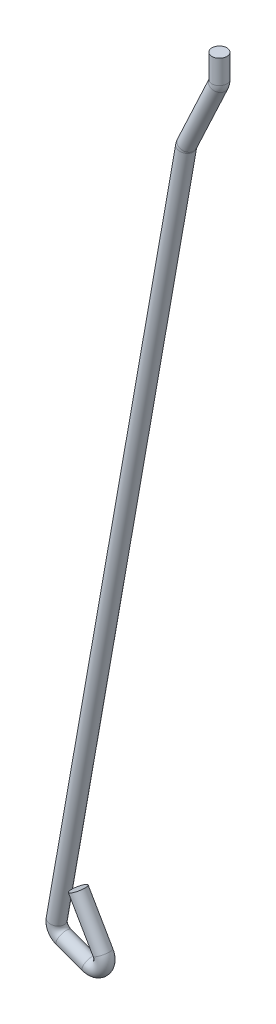
ISO-10303-21;
HEADER;
FILE_DESCRIPTION(('STEP AP214'),'2;1');
FILE_NAME('part.step','',(''),(''),'','','');
FILE_SCHEMA(('AUTOMOTIVE_DESIGN { 1 0 10303 214 1 1 1 1 }'));
ENDSEC;
DATA;
#1=APPLICATION_CONTEXT('core data for automotive mechanical design processes');
#2=APPLICATION_PROTOCOL_DEFINITION('international standard','automotive_design',2000,#1);
#3=PRODUCT_CONTEXT('',#1,'mechanical');
#4=PRODUCT('Part','Part','',(#3));
#5=PRODUCT_RELATED_PRODUCT_CATEGORY('part','',(#4));
#6=PRODUCT_DEFINITION_FORMATION('','',#4);
#7=PRODUCT_DEFINITION_CONTEXT('part definition',#1,'design');
#8=PRODUCT_DEFINITION('design','',#6,#7);
#9=PRODUCT_DEFINITION_SHAPE('','',#8);
#10=(LENGTH_UNIT() NAMED_UNIT(*) SI_UNIT(.MILLI.,.METRE.));
#11=(NAMED_UNIT(*) PLANE_ANGLE_UNIT() SI_UNIT($,.RADIAN.));
#12=(NAMED_UNIT(*) SI_UNIT($,.STERADIAN.) SOLID_ANGLE_UNIT());
#13=UNCERTAINTY_MEASURE_WITH_UNIT(LENGTH_MEASURE(1.E-05),#10,'distance_accuracy_value','');
#14=(GEOMETRIC_REPRESENTATION_CONTEXT(3) GLOBAL_UNCERTAINTY_ASSIGNED_CONTEXT((#13)) GLOBAL_UNIT_ASSIGNED_CONTEXT((#10,
#11,#12)) REPRESENTATION_CONTEXT('',''));
#15=CARTESIAN_POINT('',(0.,0.,0.));
#16=DIRECTION('',(0.,0.,1.));
#17=DIRECTION('',(1.,0.,0.));
#18=AXIS2_PLACEMENT_3D('',#15,#16,#17);
#19=CARTESIAN_POINT('',(-0.0594945552317272,0.,0.));
#20=DIRECTION('',(0.,1.,0.));
#21=DIRECTION('',(0.,0.,1.));
#22=AXIS2_PLACEMENT_3D('',#19,#20,#21);
#23=PLANE('',#22);
#24=CARTESIAN_POINT('',(-0.0594945552317272,0.,0.));
#25=DIRECTION('',(0.,1.,0.));
#26=DIRECTION('',(0.,0.,1.));
#27=AXIS2_PLACEMENT_3D('',#24,#25,#26);
#28=CIRCLE('',#27,0.9144);
#29=CARTESIAN_POINT('',(-0.0594945552317272,0.,0.9144));
#30=VERTEX_POINT('',#29);
#31=EDGE_CURVE('E67',#30,#30,#28,.T.);
#32=ORIENTED_EDGE('',*,*,#31,.T.);
#33=EDGE_LOOP('',(#32));
#34=FACE_BOUND('',#33,.T.);
#35=ADVANCED_FACE('F33',(#34),#23,.T.);
#36=CARTESIAN_POINT('',(-17.2662609280572,-96.919901169108,0.));
#37=DIRECTION('',(0.500000000000007,-0.866025403784434,0.));
#38=DIRECTION('',(0.,0.,1.));
#39=AXIS2_PLACEMENT_3D('',#36,#37,#38);
#40=PLANE('',#39);
#41=CARTESIAN_POINT('',(-17.2662609280572,-96.919901169108,0.));
#42=DIRECTION('',(0.500000000000007,-0.866025403784434,0.));
#43=DIRECTION('',(0.,0.,1.));
#44=AXIS2_PLACEMENT_3D('',#41,#42,#43);
#45=CIRCLE('',#44,0.9144);
#46=CARTESIAN_POINT('',(-17.2662609280572,-96.919901169108,0.9144));
#47=VERTEX_POINT('',#46);
#48=EDGE_CURVE('E10',#47,#47,#45,.T.);
#49=ORIENTED_EDGE('',*,*,#48,.F.);
#50=EDGE_LOOP('',(#49));
#51=FACE_BOUND('',#50,.T.);
#52=ADVANCED_FACE('F75',(#51),#40,.F.);
#53=CARTESIAN_POINT('',(-0.0594945552317272,0.,0.));
#54=DIRECTION('',(0.,-1.,0.));
#55=DIRECTION('',(1.,0.,0.));
#56=AXIS2_PLACEMENT_3D('',#53,#54,#55);
#57=CYLINDRICAL_SURFACE('',#56,0.9144);
#58=CARTESIAN_POINT('',(-0.0594945552317269,-2.89344777844347,0.));
#59=DIRECTION('',(0.,1.,0.));
#60=DIRECTION('',(0.,0.,1.));
#61=AXIS2_PLACEMENT_3D('',#58,#59,#60);
#62=CIRCLE('',#61,0.9144);
#63=CARTESIAN_POINT('',(0.854905444768273,-2.89344777844347,0.));
#64=VERTEX_POINT('',#63);
#65=EDGE_CURVE('E64',#64,#64,#62,.T.);
#66=ORIENTED_EDGE('',*,*,#65,.T.);
#67=EDGE_LOOP('',(#66));
#68=FACE_BOUND('',#67,.T.);
#69=ORIENTED_EDGE('',*,*,#31,.F.);
#70=EDGE_LOOP('',(#69));
#71=FACE_BOUND('',#70,.T.);
#72=ADVANCED_FACE('F72',(#68,#71),#57,.T.);
#73=CARTESIAN_POINT('',(-1.27,-2.89344777844347,0.));
#74=DIRECTION('',(0.,0.,-1.));
#75=DIRECTION('',(-1.,0.,0.));
#76=AXIS2_PLACEMENT_3D('',#73,#74,#75);
#77=TOROIDAL_SURFACE('',#76,1.21050544476827,0.9144);
#78=CARTESIAN_POINT('',(-0.172909489156251,-3.40502948533909,0.));
#79=DIRECTION('',(0.422618261740701,0.906307787036649,0.));
#80=DIRECTION('',(0.,0.,1.));
#81=AXIS2_PLACEMENT_3D('',#78,#79,#80);
#82=CIRCLE('',#81,0.9144);
#83=CARTESIAN_POINT('',(0.655818351310061,-3.79147162387478,0.));
#84=VERTEX_POINT('',#83);
#85=EDGE_CURVE('E61',#84,#84,#82,.T.);
#86=CARTESIAN_POINT('',(-1.27,-2.89344777844347,0.));
#87=DIRECTION('',(0.,0.,-1.));
#88=DIRECTION('',(-1.,0.,0.));
#89=AXIS2_PLACEMENT_3D('',#86,#87,#88);
#90=CIRCLE('',#89,2.12490544476827);
#91=EDGE_CURVE('',#64,#84,#90,.T.);
#92=ORIENTED_EDGE('',*,*,#65,.F.);
#93=ORIENTED_EDGE('',*,*,#85,.T.);
#94=ORIENTED_EDGE('',*,*,#91,.T.);
#95=ORIENTED_EDGE('',*,*,#91,.F.);
#96=EDGE_LOOP('',(#92,#94,#93,#95));
#97=FACE_BOUND('',#96,.T.);
#98=ADVANCED_FACE('F74',(#97),#77,.T.);
#99=CARTESIAN_POINT('',(-0.172909489156251,-3.40502948533909,0.));
#100=DIRECTION('',(-0.4226182617407,-0.90630778703665,0.));
#101=DIRECTION('',(0.90630778703665,-0.4226182617407,0.));
#102=AXIS2_PLACEMENT_3D('',#99,#100,#101);
#103=CYLINDRICAL_SURFACE('',#102,0.9144);
#104=CARTESIAN_POINT('',(-4.00869810967403,-11.6309047276512,0.));
#105=DIRECTION('',(0.4226182617407,0.906307787036649,0.));
#106=DIRECTION('',(0.,0.,1.));
#107=AXIS2_PLACEMENT_3D('',#104,#105,#106);
#108=CIRCLE('',#107,0.9144);
#109=CARTESIAN_POINT('',(-4.83742595014034,-11.2444625891156,0.));
#110=VERTEX_POINT('',#109);
#111=EDGE_CURVE('E58',#110,#110,#108,.T.);
#112=ORIENTED_EDGE('',*,*,#111,.T.);
#113=EDGE_LOOP('',(#112));
#114=FACE_BOUND('',#113,.T.);
#115=ORIENTED_EDGE('',*,*,#85,.F.);
#116=EDGE_LOOP('',(#115));
#117=FACE_BOUND('',#116,.T.);
#118=ADVANCED_FACE('F82',(#114,#117),#103,.T.);
#119=CARTESIAN_POINT('',(-2.80376684144468,-12.192773405577,0.));
#120=DIRECTION('',(0.,0.,1.));
#121=DIRECTION('',(1.,0.,0.));
#122=AXIS2_PLACEMENT_3D('',#119,#120,#121);
#123=TOROIDAL_SURFACE('',#122,1.32949455523173,0.9144);
#124=CARTESIAN_POINT('',(-4.1130633870244,-11.9619090988429,0.));
#125=DIRECTION('',(0.173648177666931,0.984807753012208,0.));
#126=DIRECTION('',(0.,0.,1.));
#127=AXIS2_PLACEMENT_3D('',#124,#125,#126);
#128=CIRCLE('',#127,0.9144);
#129=CARTESIAN_POINT('',(-5.01357159637877,-11.8031252051843,0.));
#130=VERTEX_POINT('',#129);
#131=EDGE_CURVE('E55',#130,#130,#128,.T.);
#132=CARTESIAN_POINT('',(-2.80376684144468,-12.192773405577,0.));
#133=DIRECTION('',(0.,0.,1.));
#134=DIRECTION('',(1.,0.,0.));
#135=AXIS2_PLACEMENT_3D('',#132,#133,#134);
#136=CIRCLE('',#135,2.24389455523173);
#137=EDGE_CURVE('',#110,#130,#136,.T.);
#138=ORIENTED_EDGE('',*,*,#111,.F.);
#139=ORIENTED_EDGE('',*,*,#131,.T.);
#140=ORIENTED_EDGE('',*,*,#137,.T.);
#141=ORIENTED_EDGE('',*,*,#137,.F.);
#142=EDGE_LOOP('',(#138,#140,#139,#141));
#143=FACE_BOUND('',#142,.T.);
#144=ADVANCED_FACE('F107',(#143),#123,.T.);
#145=CARTESIAN_POINT('',(-4.1130633870244,-11.9619090988429,0.));
#146=DIRECTION('',(-0.173648177666931,-0.984807753012208,0.));
#147=DIRECTION('',(0.984807753012208,-0.173648177666931,0.));
#148=AXIS2_PLACEMENT_3D('',#145,#146,#147);
#149=CYLINDRICAL_SURFACE('',#148,0.9144);
#150=CARTESIAN_POINT('',(-19.8876362862867,-101.423957594663,0.));
#151=DIRECTION('',(0.173648177666931,0.984807753012208,0.));
#152=DIRECTION('',(0.,0.,1.));
#153=AXIS2_PLACEMENT_3D('',#150,#151,#152);
#154=CIRCLE('',#153,0.9144);
#155=CARTESIAN_POINT('',(-20.788144495641,-101.265173701004,0.));
#156=VERTEX_POINT('',#155);
#157=EDGE_CURVE('E52',#156,#156,#154,.T.);
#158=ORIENTED_EDGE('',*,*,#157,.T.);
#159=EDGE_LOOP('',(#158));
#160=FACE_BOUND('',#159,.T.);
#161=ORIENTED_EDGE('',*,*,#131,.F.);
#162=EDGE_LOOP('',(#161));
#163=FACE_BOUND('',#162,.T.);
#164=ADVANCED_FACE('F103',(#160,#163),#149,.T.);
#165=CARTESIAN_POINT('',(-18.5783397407069,-101.654821901397,0.));
#166=DIRECTION('',(0.,0.,1.));
#167=DIRECTION('',(1.,0.,0.));
#168=AXIS2_PLACEMENT_3D('',#165,#166,#167);
#169=TOROIDAL_SURFACE('',#168,1.32949455523173,0.9144);
#170=CARTESIAN_POINT('',(-19.033053659038,-102.904138124323,0.));
#171=DIRECTION('',(-0.939692620785909,0.342020143325668,0.));
#172=DIRECTION('',(0.,0.,1.));
#173=AXIS2_PLACEMENT_3D('',#170,#171,#172);
#174=CIRCLE('',#173,0.9144);
#175=CARTESIAN_POINT('',(-19.345796878095,-103.76339305677,0.));
#176=VERTEX_POINT('',#175);
#177=EDGE_CURVE('E47',#176,#176,#174,.T.);
#178=CARTESIAN_POINT('',(-18.5783397407069,-101.654821901397,0.));
#179=DIRECTION('',(0.,0.,1.));
#180=DIRECTION('',(1.,0.,0.));
#181=AXIS2_PLACEMENT_3D('',#178,#179,#180);
#182=CIRCLE('',#181,2.24389455523173);
#183=EDGE_CURVE('',#156,#176,#182,.T.);
#184=ORIENTED_EDGE('',*,*,#157,.F.);
#185=ORIENTED_EDGE('',*,*,#177,.T.);
#186=ORIENTED_EDGE('',*,*,#183,.T.);
#187=ORIENTED_EDGE('',*,*,#183,.F.);
#188=EDGE_LOOP('',(#184,#186,#185,#187));
#189=FACE_BOUND('',#188,.T.);
#190=ADVANCED_FACE('F99',(#189),#169,.T.);
#191=CARTESIAN_POINT('',(-19.033053659038,-102.904138124323,0.));
#192=DIRECTION('',(0.93969262078591,-0.342020143325665,0.));
#193=DIRECTION('',(0.342020143325665,0.93969262078591,0.));
#194=AXIS2_PLACEMENT_3D('',#191,#192,#193);
#195=CYLINDRICAL_SURFACE('',#194,0.9144);
#196=CARTESIAN_POINT('',(-15.8544990667656,-104.061037383901,0.));
#197=DIRECTION('',(-0.93969262078591,0.342020143325666,0.));
#198=DIRECTION('',(0.,0.,1.));
#199=AXIS2_PLACEMENT_3D('',#196,#197,#198);
#200=CIRCLE('',#199,0.9144);
#201=CARTESIAN_POINT('',(-16.1672422858226,-104.920292316347,0.));
#202=VERTEX_POINT('',#201);
#203=EDGE_CURVE('E43',#202,#202,#200,.T.);
#204=ORIENTED_EDGE('',*,*,#203,.T.);
#205=EDGE_LOOP('',(#204));
#206=FACE_BOUND('',#205,.T.);
#207=ORIENTED_EDGE('',*,*,#177,.F.);
#208=EDGE_LOOP('',(#207));
#209=FACE_BOUND('',#208,.T.);
#210=ADVANCED_FACE('F93',(#206,#209),#195,.T.);
#211=CARTESIAN_POINT('',(-15.3997851484346,-102.811721160974,0.));
#212=DIRECTION('',(0.,0.,1.));
#213=DIRECTION('',(1.,0.,0.));
#214=AXIS2_PLACEMENT_3D('',#211,#212,#213);
#215=TOROIDAL_SURFACE('',#214,1.32949455523174,0.9144);
#216=CARTESIAN_POINT('',(-14.2484090894109,-102.146973883359,0.));
#217=DIRECTION('',(0.499999999999996,-0.866025403784441,0.));
#218=DIRECTION('',(0.,0.,1.));
#219=AXIS2_PLACEMENT_3D('',#216,#217,#218);
#220=CIRCLE('',#219,0.9144);
#221=CARTESIAN_POINT('',(-13.4565154601904,-101.689773883359,0.));
#222=VERTEX_POINT('',#221);
#223=EDGE_CURVE('E39',#222,#222,#220,.T.);
#224=CARTESIAN_POINT('',(-15.3997851484346,-102.811721160974,0.));
#225=DIRECTION('',(0.,0.,1.));
#226=DIRECTION('',(1.,0.,0.));
#227=AXIS2_PLACEMENT_3D('',#224,#225,#226);
#228=CIRCLE('',#227,2.24389455523174);
#229=EDGE_CURVE('',#202,#222,#228,.T.);
#230=ORIENTED_EDGE('',*,*,#203,.F.);
#231=ORIENTED_EDGE('',*,*,#223,.T.);
#232=ORIENTED_EDGE('',*,*,#229,.T.);
#233=ORIENTED_EDGE('',*,*,#229,.F.);
#234=EDGE_LOOP('',(#230,#232,#231,#233));
#235=FACE_BOUND('',#234,.T.);
#236=ADVANCED_FACE('F88',(#235),#215,.T.);
#237=CARTESIAN_POINT('',(-14.2484090894108,-102.146973883359,0.));
#238=DIRECTION('',(-0.500000000000007,0.866025403784434,0.));
#239=DIRECTION('',(-0.866025403784434,-0.500000000000007,0.));
#240=AXIS2_PLACEMENT_3D('',#237,#238,#239);
#241=CYLINDRICAL_SURFACE('',#240,0.9144);
#242=ORIENTED_EDGE('',*,*,#48,.T.);
#243=EDGE_LOOP('',(#242));
#244=FACE_BOUND('',#243,.T.);
#245=ORIENTED_EDGE('',*,*,#223,.F.);
#246=EDGE_LOOP('',(#245));
#247=FACE_BOUND('',#246,.T.);
#248=ADVANCED_FACE('F86',(#244,#247),#241,.T.);
#249=CLOSED_SHELL('',(#35,#52,#72,#98,#118,#144,#164,#190,#210,#236,#248));
#250=MANIFOLD_SOLID_BREP('B2',#249);
#251=ADVANCED_BREP_SHAPE_REPRESENTATION('',(#18,#250),#14);
#252=SHAPE_DEFINITION_REPRESENTATION(#9,#251);
ENDSEC;
END-ISO-10303-21;
